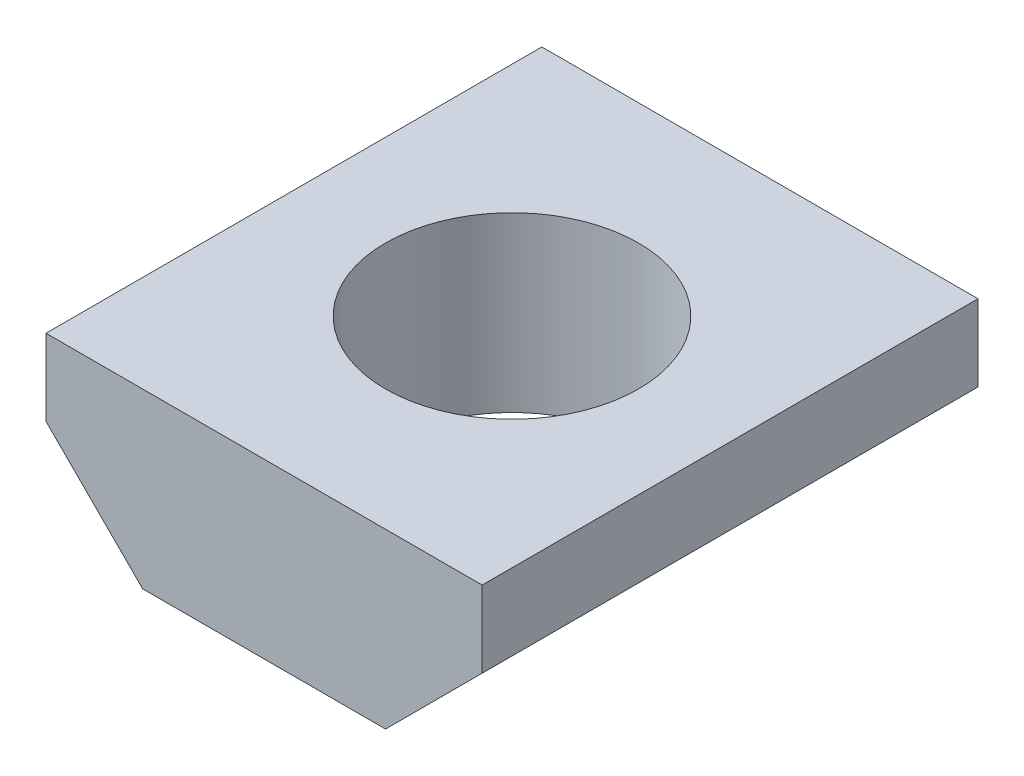
ISO-10303-21;
HEADER;
FILE_DESCRIPTION(('STEP AP214'),'2;1');
FILE_NAME('part.step','',(''),(''),'','','');
FILE_SCHEMA(('AUTOMOTIVE_DESIGN { 1 0 10303 214 1 1 1 1 }'));
ENDSEC;
DATA;
#1=APPLICATION_CONTEXT('core data for automotive mechanical design processes');
#2=APPLICATION_PROTOCOL_DEFINITION('international standard','automotive_design',2000,#1);
#3=PRODUCT_CONTEXT('',#1,'mechanical');
#4=PRODUCT('Part','Part','',(#3));
#5=PRODUCT_RELATED_PRODUCT_CATEGORY('part','',(#4));
#6=PRODUCT_DEFINITION_FORMATION('','',#4);
#7=PRODUCT_DEFINITION_CONTEXT('part definition',#1,'design');
#8=PRODUCT_DEFINITION('design','',#6,#7);
#9=PRODUCT_DEFINITION_SHAPE('','',#8);
#10=(LENGTH_UNIT() NAMED_UNIT(*) SI_UNIT(.MILLI.,.METRE.));
#11=(NAMED_UNIT(*) PLANE_ANGLE_UNIT() SI_UNIT($,.RADIAN.));
#12=(NAMED_UNIT(*) SI_UNIT($,.STERADIAN.) SOLID_ANGLE_UNIT());
#13=UNCERTAINTY_MEASURE_WITH_UNIT(LENGTH_MEASURE(1.E-05),#10,'distance_accuracy_value','');
#14=(GEOMETRIC_REPRESENTATION_CONTEXT(3) GLOBAL_UNCERTAINTY_ASSIGNED_CONTEXT((#13)) GLOBAL_UNIT_ASSIGNED_CONTEXT((#10,
#11,#12)) REPRESENTATION_CONTEXT('',''));
#15=CARTESIAN_POINT('',(0.,0.,0.));
#16=DIRECTION('',(0.,0.,1.));
#17=DIRECTION('',(1.,0.,0.));
#18=AXIS2_PLACEMENT_3D('',#15,#16,#17);
#19=CARTESIAN_POINT('',(3.048,-4.3434,12.446));
#20=DIRECTION('',(0.,1.,0.));
#21=DIRECTION('',(0.,0.,1.));
#22=AXIS2_PLACEMENT_3D('',#19,#20,#21);
#23=PLANE('',#22);
#24=DIRECTION('',(0.,0.,-1.));
#25=VECTOR('',#24,1.);
#26=CARTESIAN_POINT('',(3.048,-4.3434,12.446));
#27=LINE('',#26,#25);
#28=CARTESIAN_POINT('',(3.048,-4.3434,5.33400000000001));
#29=VERTEX_POINT('',#28);
#30=CARTESIAN_POINT('',(3.048,-4.3434,0.));
#31=VERTEX_POINT('',#30);
#32=EDGE_CURVE('E127',#29,#31,#27,.T.);
#33=ORIENTED_EDGE('',*,*,#32,.F.);
#34=CARTESIAN_POINT('',(0.,-4.3434,6.223));
#35=DIRECTION('',(0.,1.,0.));
#36=DIRECTION('',(0.,0.,1.));
#37=AXIS2_PLACEMENT_3D('',#34,#35,#36);
#38=CIRCLE('',#37,3.175);
#39=CARTESIAN_POINT('',(-3.048,-4.3434,5.334));
#40=VERTEX_POINT('',#39);
#41=EDGE_CURVE('E11',#29,#40,#38,.T.);
#42=ORIENTED_EDGE('',*,*,#41,.T.);
#43=DIRECTION('',(0.,0.,-1.));
#44=VECTOR('',#43,1.);
#45=CARTESIAN_POINT('',(-3.048,-4.3434,12.446));
#46=LINE('',#45,#44);
#47=CARTESIAN_POINT('',(-3.048,-4.3434,0.));
#48=VERTEX_POINT('',#47);
#49=EDGE_CURVE('E155',#40,#48,#46,.T.);
#50=ORIENTED_EDGE('',*,*,#49,.T.);
#51=DIRECTION('',(1.,0.,0.));
#52=VECTOR('',#51,1.);
#53=CARTESIAN_POINT('',(3.048,-4.3434,0.));
#54=LINE('',#53,#52);
#55=EDGE_CURVE('E143',#48,#31,#54,.T.);
#56=ORIENTED_EDGE('',*,*,#55,.T.);
#57=EDGE_LOOP('',(#33,#42,#50,#56));
#58=FACE_BOUND('',#57,.T.);
#59=ADVANCED_FACE('F39',(#58),#23,.F.);
#60=CARTESIAN_POINT('',(-5.4737,0.,12.446));
#61=DIRECTION('',(0.,-1.,0.));
#62=DIRECTION('',(0.,0.,-1.));
#63=AXIS2_PLACEMENT_3D('',#60,#61,#62);
#64=PLANE('',#63);
#65=DIRECTION('',(-1.,0.,0.));
#66=VECTOR('',#65,1.);
#67=CARTESIAN_POINT('',(-5.4737,0.,0.));
#68=LINE('',#67,#66);
#69=CARTESIAN_POINT('',(5.4737,0.,0.));
#70=VERTEX_POINT('',#69);
#71=CARTESIAN_POINT('',(-5.4737,0.,0.));
#72=VERTEX_POINT('',#71);
#73=EDGE_CURVE('E90',#70,#72,#68,.T.);
#74=ORIENTED_EDGE('',*,*,#73,.T.);
#75=DIRECTION('',(0.,0.,-1.));
#76=VECTOR('',#75,1.);
#77=CARTESIAN_POINT('',(-5.4737,0.,12.446));
#78=LINE('',#77,#76);
#79=CARTESIAN_POINT('',(-5.4737,0.,12.446));
#80=VERTEX_POINT('',#79);
#81=EDGE_CURVE('E132',#80,#72,#78,.T.);
#82=ORIENTED_EDGE('',*,*,#81,.F.);
#83=DIRECTION('',(-1.,0.,0.));
#84=VECTOR('',#83,1.);
#85=CARTESIAN_POINT('',(-5.4737,0.,12.446));
#86=LINE('',#85,#84);
#87=CARTESIAN_POINT('',(5.4737,0.,12.446));
#88=VERTEX_POINT('',#87);
#89=EDGE_CURVE('E63',#88,#80,#86,.T.);
#90=ORIENTED_EDGE('',*,*,#89,.F.);
#91=DIRECTION('',(0.,0.,-1.));
#92=VECTOR('',#91,1.);
#93=CARTESIAN_POINT('',(5.4737,0.,12.446));
#94=LINE('',#93,#92);
#95=EDGE_CURVE('E128',#88,#70,#94,.T.);
#96=ORIENTED_EDGE('',*,*,#95,.T.);
#97=EDGE_LOOP('',(#74,#82,#90,#96));
#98=FACE_BOUND('',#97,.T.);
#99=CARTESIAN_POINT('',(0.,0.,6.223));
#100=DIRECTION('',(0.,1.,0.));
#101=DIRECTION('',(0.,0.,1.));
#102=AXIS2_PLACEMENT_3D('',#99,#100,#101);
#103=CIRCLE('',#102,3.175);
#104=CARTESIAN_POINT('',(0.,0.,9.398));
#105=VERTEX_POINT('',#104);
#106=EDGE_CURVE('E168',#105,#105,#103,.T.);
#107=ORIENTED_EDGE('',*,*,#106,.F.);
#108=EDGE_LOOP('',(#107));
#109=FACE_BOUND('',#108,.T.);
#110=ADVANCED_FACE('F176',(#98,#109),#64,.F.);
#111=CARTESIAN_POINT('',(-5.4737,-1.91770000000001,12.446));
#112=DIRECTION('',(1.,0.,0.));
#113=DIRECTION('',(0.,1.,0.));
#114=AXIS2_PLACEMENT_3D('',#111,#112,#113);
#115=PLANE('',#114);
#116=DIRECTION('',(0.,-1.,0.));
#117=VECTOR('',#116,1.);
#118=CARTESIAN_POINT('',(-5.4737,-1.91770000000001,0.));
#119=LINE('',#118,#117);
#120=CARTESIAN_POINT('',(-5.4737,-1.91770000000001,0.));
#121=VERTEX_POINT('',#120);
#122=EDGE_CURVE('E136',#72,#121,#119,.T.);
#123=ORIENTED_EDGE('',*,*,#122,.T.);
#124=DIRECTION('',(0.,0.,-1.));
#125=VECTOR('',#124,1.);
#126=CARTESIAN_POINT('',(-5.4737,-1.91770000000001,12.446));
#127=LINE('',#126,#125);
#128=CARTESIAN_POINT('',(-5.4737,-1.91770000000001,12.446));
#129=VERTEX_POINT('',#128);
#130=EDGE_CURVE('E158',#129,#121,#127,.T.);
#131=ORIENTED_EDGE('',*,*,#130,.F.);
#132=DIRECTION('',(0.,-1.,0.));
#133=VECTOR('',#132,1.);
#134=CARTESIAN_POINT('',(-5.4737,-1.91770000000001,12.446));
#135=LINE('',#134,#133);
#136=EDGE_CURVE('E150',#80,#129,#135,.T.);
#137=ORIENTED_EDGE('',*,*,#136,.F.);
#138=ORIENTED_EDGE('',*,*,#81,.T.);
#139=EDGE_LOOP('',(#123,#131,#137,#138));
#140=FACE_BOUND('',#139,.T.);
#141=ADVANCED_FACE('F41',(#140),#115,.F.);
#142=CARTESIAN_POINT('',(-3.048,-4.3434,12.446));
#143=DIRECTION('',(0.707106781186546,0.707106781186549,0.));
#144=DIRECTION('',(-0.707106781186549,0.707106781186546,0.));
#145=AXIS2_PLACEMENT_3D('',#142,#143,#144);
#146=PLANE('',#145);
#147=ORIENTED_EDGE('',*,*,#49,.F.);
#148=CARTESIAN_POINT('',(0.,-7.39139999999998,6.223));
#149=DIRECTION('',(0.707106781186546,0.707106781186549,0.));
#150=DIRECTION('',(-0.707106781186549,0.707106781186546,0.));
#151=AXIS2_PLACEMENT_3D('',#148,#149,#150);
#152=ELLIPSE('',#151,4.49012806053457,3.175);
#153=CARTESIAN_POINT('',(-3.048,-4.3434,7.112));
#154=VERTEX_POINT('',#153);
#155=EDGE_CURVE('E140',#40,#154,#152,.T.);
#156=ORIENTED_EDGE('',*,*,#155,.T.);
#157=CARTESIAN_POINT('',(-3.048,-4.3434,12.446));
#158=VERTEX_POINT('',#157);
#159=EDGE_CURVE('E156',#158,#154,#46,.T.);
#160=ORIENTED_EDGE('',*,*,#159,.F.);
#161=DIRECTION('',(0.707106781186549,-0.707106781186546,0.));
#162=VECTOR('',#161,1.);
#163=CARTESIAN_POINT('',(-3.048,-4.3434,12.446));
#164=LINE('',#163,#162);
#165=EDGE_CURVE('E99',#129,#158,#164,.T.);
#166=ORIENTED_EDGE('',*,*,#165,.F.);
#167=ORIENTED_EDGE('',*,*,#130,.T.);
#168=DIRECTION('',(0.707106781186549,-0.707106781186546,0.));
#169=VECTOR('',#168,1.);
#170=CARTESIAN_POINT('',(-3.048,-4.3434,0.));
#171=LINE('',#170,#169);
#172=EDGE_CURVE('E139',#121,#48,#171,.T.);
#173=ORIENTED_EDGE('',*,*,#172,.T.);
#174=EDGE_LOOP('',(#147,#156,#160,#166,#167,#173));
#175=FACE_BOUND('',#174,.T.);
#176=ADVANCED_FACE('F195',(#175),#146,.F.);
#177=ORIENTED_EDGE('',*,*,#159,.T.);
#178=CARTESIAN_POINT('',(3.048,-4.3434,7.11199999999999));
#179=VERTEX_POINT('',#178);
#180=EDGE_CURVE('E43',#154,#179,#38,.T.);
#181=ORIENTED_EDGE('',*,*,#180,.T.);
#182=CARTESIAN_POINT('',(3.048,-4.3434,12.446));
#183=VERTEX_POINT('',#182);
#184=EDGE_CURVE('E153',#183,#179,#27,.T.);
#185=ORIENTED_EDGE('',*,*,#184,.F.);
#186=DIRECTION('',(1.,0.,0.));
#187=VECTOR('',#186,1.);
#188=CARTESIAN_POINT('',(3.048,-4.3434,12.446));
#189=LINE('',#188,#187);
#190=EDGE_CURVE('E115',#158,#183,#189,.T.);
#191=ORIENTED_EDGE('',*,*,#190,.F.);
#192=EDGE_LOOP('',(#177,#181,#185,#191));
#193=FACE_BOUND('',#192,.T.);
#194=ADVANCED_FACE('F161',(#193),#23,.F.);
#195=CARTESIAN_POINT('',(5.4737,-1.91770000000001,12.446));
#196=DIRECTION('',(-0.707106781186546,0.707106781186549,0.));
#197=DIRECTION('',(-0.707106781186549,-0.707106781186546,0.));
#198=AXIS2_PLACEMENT_3D('',#195,#196,#197);
#199=PLANE('',#198);
#200=ORIENTED_EDGE('',*,*,#184,.T.);
#201=CARTESIAN_POINT('',(0.,-7.39139999999999,6.223));
#202=DIRECTION('',(-0.707106781186546,0.707106781186549,0.));
#203=DIRECTION('',(0.707106781186549,0.707106781186546,0.));
#204=AXIS2_PLACEMENT_3D('',#201,#202,#203);
#205=ELLIPSE('',#204,4.49012806053457,3.175);
#206=EDGE_CURVE('E54',#179,#29,#205,.T.);
#207=ORIENTED_EDGE('',*,*,#206,.T.);
#208=ORIENTED_EDGE('',*,*,#32,.T.);
#209=DIRECTION('',(0.707106781186549,0.707106781186546,0.));
#210=VECTOR('',#209,1.);
#211=CARTESIAN_POINT('',(5.4737,-1.91770000000001,0.));
#212=LINE('',#211,#210);
#213=CARTESIAN_POINT('',(5.4737,-1.91770000000001,0.));
#214=VERTEX_POINT('',#213);
#215=EDGE_CURVE('E124',#31,#214,#212,.T.);
#216=ORIENTED_EDGE('',*,*,#215,.T.);
#217=DIRECTION('',(0.,0.,-1.));
#218=VECTOR('',#217,1.);
#219=CARTESIAN_POINT('',(5.4737,-1.91770000000001,12.446));
#220=LINE('',#219,#218);
#221=CARTESIAN_POINT('',(5.4737,-1.91770000000001,12.446));
#222=VERTEX_POINT('',#221);
#223=EDGE_CURVE('E121',#222,#214,#220,.T.);
#224=ORIENTED_EDGE('',*,*,#223,.F.);
#225=DIRECTION('',(0.707106781186549,0.707106781186546,0.));
#226=VECTOR('',#225,1.);
#227=CARTESIAN_POINT('',(5.4737,-1.91770000000001,12.446));
#228=LINE('',#227,#226);
#229=EDGE_CURVE('E108',#183,#222,#228,.T.);
#230=ORIENTED_EDGE('',*,*,#229,.F.);
#231=EDGE_LOOP('',(#200,#207,#208,#216,#224,#230));
#232=FACE_BOUND('',#231,.T.);
#233=ADVANCED_FACE('F122',(#232),#199,.F.);
#234=CARTESIAN_POINT('',(5.4737,0.,12.446));
#235=DIRECTION('',(-1.,0.,0.));
#236=DIRECTION('',(0.,-1.,0.));
#237=AXIS2_PLACEMENT_3D('',#234,#235,#236);
#238=PLANE('',#237);
#239=DIRECTION('',(0.,1.,0.));
#240=VECTOR('',#239,1.);
#241=CARTESIAN_POINT('',(5.4737,0.,0.));
#242=LINE('',#241,#240);
#243=EDGE_CURVE('E147',#214,#70,#242,.T.);
#244=ORIENTED_EDGE('',*,*,#243,.T.);
#245=ORIENTED_EDGE('',*,*,#95,.F.);
#246=DIRECTION('',(0.,1.,0.));
#247=VECTOR('',#246,1.);
#248=CARTESIAN_POINT('',(5.4737,0.,12.446));
#249=LINE('',#248,#247);
#250=EDGE_CURVE('E112',#222,#88,#249,.T.);
#251=ORIENTED_EDGE('',*,*,#250,.F.);
#252=ORIENTED_EDGE('',*,*,#223,.T.);
#253=EDGE_LOOP('',(#244,#245,#251,#252));
#254=FACE_BOUND('',#253,.T.);
#255=ADVANCED_FACE('F130',(#254),#238,.F.);
#256=CARTESIAN_POINT('',(0.,0.,12.446));
#257=DIRECTION('',(0.,0.,-1.));
#258=DIRECTION('',(-1.,0.,0.));
#259=AXIS2_PLACEMENT_3D('',#256,#257,#258);
#260=PLANE('',#259);
#261=ORIENTED_EDGE('',*,*,#136,.T.);
#262=ORIENTED_EDGE('',*,*,#165,.T.);
#263=ORIENTED_EDGE('',*,*,#190,.T.);
#264=ORIENTED_EDGE('',*,*,#229,.T.);
#265=ORIENTED_EDGE('',*,*,#250,.T.);
#266=ORIENTED_EDGE('',*,*,#89,.T.);
#267=EDGE_LOOP('',(#261,#262,#263,#264,#265,#266));
#268=FACE_BOUND('',#267,.T.);
#269=ADVANCED_FACE('F110',(#268),#260,.F.);
#270=CARTESIAN_POINT('',(0.,0.,0.));
#271=DIRECTION('',(0.,0.,-1.));
#272=DIRECTION('',(-1.,0.,0.));
#273=AXIS2_PLACEMENT_3D('',#270,#271,#272);
#274=PLANE('',#273);
#275=ORIENTED_EDGE('',*,*,#122,.F.);
#276=ORIENTED_EDGE('',*,*,#73,.F.);
#277=ORIENTED_EDGE('',*,*,#243,.F.);
#278=ORIENTED_EDGE('',*,*,#215,.F.);
#279=ORIENTED_EDGE('',*,*,#55,.F.);
#280=ORIENTED_EDGE('',*,*,#172,.F.);
#281=EDGE_LOOP('',(#275,#276,#277,#278,#279,#280));
#282=FACE_BOUND('',#281,.T.);
#283=ADVANCED_FACE('F175',(#282),#274,.T.);
#284=CARTESIAN_POINT('',(0.,0.,6.223));
#285=DIRECTION('',(0.,1.,0.));
#286=DIRECTION('',(0.,0.,1.));
#287=AXIS2_PLACEMENT_3D('',#284,#285,#286);
#288=CYLINDRICAL_SURFACE('',#287,3.175);
#289=ORIENTED_EDGE('',*,*,#106,.T.);
#290=EDGE_LOOP('',(#289));
#291=FACE_BOUND('',#290,.T.);
#292=ORIENTED_EDGE('',*,*,#41,.F.);
#293=ORIENTED_EDGE('',*,*,#206,.F.);
#294=ORIENTED_EDGE('',*,*,#180,.F.);
#295=ORIENTED_EDGE('',*,*,#155,.F.);
#296=EDGE_LOOP('',(#292,#293,#294,#295));
#297=FACE_BOUND('',#296,.T.);
#298=ADVANCED_FACE('F187',(#291,#297),#288,.F.);
#299=CLOSED_SHELL('',(#59,#110,#141,#176,#194,#233,#255,#269,#283,#298));
#300=MANIFOLD_SOLID_BREP('B2',#299);
#301=ADVANCED_BREP_SHAPE_REPRESENTATION('',(#18,#300),#14);
#302=SHAPE_DEFINITION_REPRESENTATION(#9,#301);
ENDSEC;
END-ISO-10303-21;
